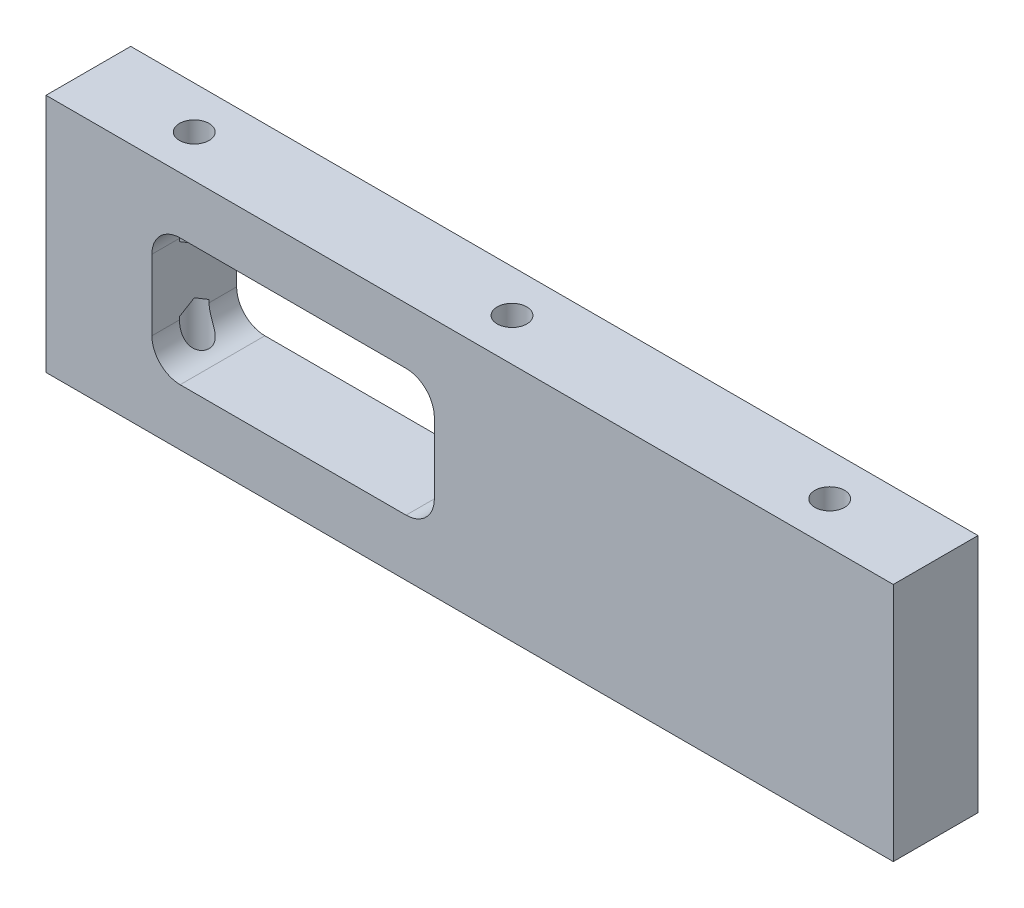
ISO-10303-21;
HEADER;
FILE_DESCRIPTION(('STEP AP214'),'2;1');
FILE_NAME('part.step','',(''),(''),'','','');
FILE_SCHEMA(('AUTOMOTIVE_DESIGN { 1 0 10303 214 1 1 1 1 }'));
ENDSEC;
DATA;
#1=APPLICATION_CONTEXT('core data for automotive mechanical design processes');
#2=APPLICATION_PROTOCOL_DEFINITION('international standard','automotive_design',2000,#1);
#3=PRODUCT_CONTEXT('',#1,'mechanical');
#4=PRODUCT('Part','Part','',(#3));
#5=PRODUCT_RELATED_PRODUCT_CATEGORY('part','',(#4));
#6=PRODUCT_DEFINITION_FORMATION('','',#4);
#7=PRODUCT_DEFINITION_CONTEXT('part definition',#1,'design');
#8=PRODUCT_DEFINITION('design','',#6,#7);
#9=PRODUCT_DEFINITION_SHAPE('','',#8);
#10=(LENGTH_UNIT() NAMED_UNIT(*) SI_UNIT(.MILLI.,.METRE.));
#11=(NAMED_UNIT(*) PLANE_ANGLE_UNIT() SI_UNIT($,.RADIAN.));
#12=(NAMED_UNIT(*) SI_UNIT($,.STERADIAN.) SOLID_ANGLE_UNIT());
#13=UNCERTAINTY_MEASURE_WITH_UNIT(LENGTH_MEASURE(1.E-05),#10,'distance_accuracy_value','');
#14=(GEOMETRIC_REPRESENTATION_CONTEXT(3) GLOBAL_UNCERTAINTY_ASSIGNED_CONTEXT((#13)) GLOBAL_UNIT_ASSIGNED_CONTEXT((#10,
#11,#12)) REPRESENTATION_CONTEXT('',''));
#15=CARTESIAN_POINT('',(0.,0.,0.));
#16=DIRECTION('',(0.,0.,1.));
#17=DIRECTION('',(1.,0.,0.));
#18=AXIS2_PLACEMENT_3D('',#15,#16,#17);
#19=CARTESIAN_POINT('',(0.,0.,12.));
#20=DIRECTION('',(1.,0.,0.));
#21=DIRECTION('',(0.,0.,-1.));
#22=AXIS2_PLACEMENT_3D('',#19,#20,#21);
#23=PLANE('',#22);
#24=DIRECTION('',(0.,-1.,0.));
#25=VECTOR('',#24,1.);
#26=CARTESIAN_POINT('',(0.,0.,0.));
#27=LINE('',#26,#25);
#28=CARTESIAN_POINT('',(0.,34.,0.));
#29=VERTEX_POINT('',#28);
#30=CARTESIAN_POINT('',(0.,0.,0.));
#31=VERTEX_POINT('',#30);
#32=EDGE_CURVE('E236',#29,#31,#27,.T.);
#33=ORIENTED_EDGE('',*,*,#32,.T.);
#34=DIRECTION('',(0.,0.,-1.));
#35=VECTOR('',#34,1.);
#36=CARTESIAN_POINT('',(0.,0.,12.));
#37=LINE('',#36,#35);
#38=CARTESIAN_POINT('',(0.,0.,12.));
#39=VERTEX_POINT('',#38);
#40=EDGE_CURVE('E273',#39,#31,#37,.T.);
#41=ORIENTED_EDGE('',*,*,#40,.F.);
#42=DIRECTION('',(0.,-1.,0.));
#43=VECTOR('',#42,1.);
#44=CARTESIAN_POINT('',(0.,0.,12.));
#45=LINE('',#44,#43);
#46=CARTESIAN_POINT('',(0.,34.,12.));
#47=VERTEX_POINT('',#46);
#48=EDGE_CURVE('E247',#47,#39,#45,.T.);
#49=ORIENTED_EDGE('',*,*,#48,.F.);
#50=DIRECTION('',(0.,0.,-1.));
#51=VECTOR('',#50,1.);
#52=CARTESIAN_POINT('',(0.,34.,12.));
#53=LINE('',#52,#51);
#54=EDGE_CURVE('E257',#47,#29,#53,.T.);
#55=ORIENTED_EDGE('',*,*,#54,.T.);
#56=EDGE_LOOP('',(#33,#41,#49,#55));
#57=FACE_BOUND('',#56,.T.);
#58=ADVANCED_FACE('F37',(#57),#23,.F.);
#59=CARTESIAN_POINT('',(0.,0.,12.));
#60=DIRECTION('',(0.,1.,0.));
#61=DIRECTION('',(0.,0.,1.));
#62=AXIS2_PLACEMENT_3D('',#59,#60,#61);
#63=PLANE('',#62);
#64=CARTESIAN_POINT('',(105.,0.,6.));
#65=DIRECTION('',(0.,-1.,0.));
#66=DIRECTION('',(0.,0.,-1.));
#67=AXIS2_PLACEMENT_3D('',#64,#65,#66);
#68=CIRCLE('',#67,2.09999999999999);
#69=CARTESIAN_POINT('',(105.,0.,3.90000000000001));
#70=VERTEX_POINT('',#69);
#71=EDGE_CURVE('E180',#70,#70,#68,.T.);
#72=ORIENTED_EDGE('',*,*,#71,.F.);
#73=EDGE_LOOP('',(#72));
#74=FACE_BOUND('',#73,.T.);
#75=CARTESIAN_POINT('',(60.,0.,6.));
#76=DIRECTION('',(0.,-1.,0.));
#77=DIRECTION('',(0.,0.,-1.));
#78=AXIS2_PLACEMENT_3D('',#75,#76,#77);
#79=CIRCLE('',#78,2.09999999999999);
#80=CARTESIAN_POINT('',(60.,0.,3.90000000000001));
#81=VERTEX_POINT('',#80);
#82=EDGE_CURVE('E179',#81,#81,#79,.T.);
#83=ORIENTED_EDGE('',*,*,#82,.F.);
#84=EDGE_LOOP('',(#83));
#85=FACE_BOUND('',#84,.T.);
#86=CARTESIAN_POINT('',(15.,0.,6.));
#87=DIRECTION('',(0.,-1.,0.));
#88=DIRECTION('',(0.,0.,-1.));
#89=AXIS2_PLACEMENT_3D('',#86,#87,#88);
#90=CIRCLE('',#89,2.09999999999999);
#91=CARTESIAN_POINT('',(15.,0.,3.90000000000001));
#92=VERTEX_POINT('',#91);
#93=EDGE_CURVE('E190',#92,#92,#90,.T.);
#94=ORIENTED_EDGE('',*,*,#93,.F.);
#95=EDGE_LOOP('',(#94));
#96=FACE_BOUND('',#95,.T.);
#97=DIRECTION('',(1.,0.,0.));
#98=VECTOR('',#97,1.);
#99=CARTESIAN_POINT('',(0.,0.,0.));
#100=LINE('',#99,#98);
#101=CARTESIAN_POINT('',(120.,0.,0.));
#102=VERTEX_POINT('',#101);
#103=EDGE_CURVE('E260',#31,#102,#100,.T.);
#104=ORIENTED_EDGE('',*,*,#103,.T.);
#105=DIRECTION('',(0.,0.,-1.));
#106=VECTOR('',#105,1.);
#107=CARTESIAN_POINT('',(120.,0.,12.));
#108=LINE('',#107,#106);
#109=CARTESIAN_POINT('',(120.,0.,12.));
#110=VERTEX_POINT('',#109);
#111=EDGE_CURVE('E270',#110,#102,#108,.T.);
#112=ORIENTED_EDGE('',*,*,#111,.F.);
#113=DIRECTION('',(1.,0.,0.));
#114=VECTOR('',#113,1.);
#115=CARTESIAN_POINT('',(0.,0.,12.));
#116=LINE('',#115,#114);
#117=EDGE_CURVE('E250',#39,#110,#116,.T.);
#118=ORIENTED_EDGE('',*,*,#117,.F.);
#119=ORIENTED_EDGE('',*,*,#40,.T.);
#120=EDGE_LOOP('',(#104,#112,#118,#119));
#121=FACE_BOUND('',#120,.T.);
#122=ADVANCED_FACE('F383',(#74,#85,#96,#121),#63,.F.);
#123=CARTESIAN_POINT('',(120.,0.,12.));
#124=DIRECTION('',(-1.,0.,0.));
#125=DIRECTION('',(0.,0.,1.));
#126=AXIS2_PLACEMENT_3D('',#123,#124,#125);
#127=PLANE('',#126);
#128=DIRECTION('',(0.,1.,0.));
#129=VECTOR('',#128,1.);
#130=CARTESIAN_POINT('',(120.,0.,0.));
#131=LINE('',#130,#129);
#132=CARTESIAN_POINT('',(120.,34.,0.));
#133=VERTEX_POINT('',#132);
#134=EDGE_CURVE('E262',#102,#133,#131,.T.);
#135=ORIENTED_EDGE('',*,*,#134,.T.);
#136=DIRECTION('',(0.,0.,-1.));
#137=VECTOR('',#136,1.);
#138=CARTESIAN_POINT('',(120.,34.,12.));
#139=LINE('',#138,#137);
#140=CARTESIAN_POINT('',(120.,34.,12.));
#141=VERTEX_POINT('',#140);
#142=EDGE_CURVE('E267',#141,#133,#139,.T.);
#143=ORIENTED_EDGE('',*,*,#142,.F.);
#144=DIRECTION('',(0.,1.,0.));
#145=VECTOR('',#144,1.);
#146=CARTESIAN_POINT('',(120.,0.,12.));
#147=LINE('',#146,#145);
#148=EDGE_CURVE('E253',#110,#141,#147,.T.);
#149=ORIENTED_EDGE('',*,*,#148,.F.);
#150=ORIENTED_EDGE('',*,*,#111,.T.);
#151=EDGE_LOOP('',(#135,#143,#149,#150));
#152=FACE_BOUND('',#151,.T.);
#153=ADVANCED_FACE('F379',(#152),#127,.F.);
#154=CARTESIAN_POINT('',(0.,34.,12.));
#155=DIRECTION('',(0.,-1.,0.));
#156=DIRECTION('',(0.,0.,-1.));
#157=AXIS2_PLACEMENT_3D('',#154,#155,#156);
#158=PLANE('',#157);
#159=CARTESIAN_POINT('',(15.,34.,6.));
#160=DIRECTION('',(0.,1.,0.));
#161=DIRECTION('',(0.,0.,1.));
#162=AXIS2_PLACEMENT_3D('',#159,#160,#161);
#163=CIRCLE('',#162,2.1);
#164=CARTESIAN_POINT('',(15.,34.,8.1));
#165=VERTEX_POINT('',#164);
#166=EDGE_CURVE('E200',#165,#165,#163,.T.);
#167=ORIENTED_EDGE('',*,*,#166,.F.);
#168=EDGE_LOOP('',(#167));
#169=FACE_BOUND('',#168,.T.);
#170=CARTESIAN_POINT('',(60.,34.,6.));
#171=DIRECTION('',(0.,1.,0.));
#172=DIRECTION('',(0.,0.,1.));
#173=AXIS2_PLACEMENT_3D('',#170,#171,#172);
#174=CIRCLE('',#173,2.1);
#175=CARTESIAN_POINT('',(60.,34.,8.1));
#176=VERTEX_POINT('',#175);
#177=EDGE_CURVE('E210',#176,#176,#174,.T.);
#178=ORIENTED_EDGE('',*,*,#177,.F.);
#179=EDGE_LOOP('',(#178));
#180=FACE_BOUND('',#179,.T.);
#181=CARTESIAN_POINT('',(105.,34.,6.));
#182=DIRECTION('',(0.,1.,0.));
#183=DIRECTION('',(0.,0.,1.));
#184=AXIS2_PLACEMENT_3D('',#181,#182,#183);
#185=CIRCLE('',#184,2.1);
#186=CARTESIAN_POINT('',(105.,34.,8.1));
#187=VERTEX_POINT('',#186);
#188=EDGE_CURVE('E216',#187,#187,#185,.T.);
#189=ORIENTED_EDGE('',*,*,#188,.F.);
#190=EDGE_LOOP('',(#189));
#191=FACE_BOUND('',#190,.T.);
#192=DIRECTION('',(-1.,0.,0.));
#193=VECTOR('',#192,1.);
#194=CARTESIAN_POINT('',(0.,34.,0.));
#195=LINE('',#194,#193);
#196=EDGE_CURVE('E251',#133,#29,#195,.T.);
#197=ORIENTED_EDGE('',*,*,#196,.T.);
#198=ORIENTED_EDGE('',*,*,#54,.F.);
#199=DIRECTION('',(-1.,0.,0.));
#200=VECTOR('',#199,1.);
#201=CARTESIAN_POINT('',(0.,34.,12.));
#202=LINE('',#201,#200);
#203=EDGE_CURVE('E255',#141,#47,#202,.T.);
#204=ORIENTED_EDGE('',*,*,#203,.F.);
#205=ORIENTED_EDGE('',*,*,#142,.T.);
#206=EDGE_LOOP('',(#197,#198,#204,#205));
#207=FACE_BOUND('',#206,.T.);
#208=ADVANCED_FACE('F372',(#169,#180,#191,#207),#158,.F.);
#209=CARTESIAN_POINT('',(0.,34.,12.));
#210=DIRECTION('',(0.,0.,-1.));
#211=DIRECTION('',(-1.,0.,0.));
#212=AXIS2_PLACEMENT_3D('',#209,#210,#211);
#213=PLANE('',#212);
#214=DIRECTION('',(-1.,0.,0.));
#215=VECTOR('',#214,1.);
#216=CARTESIAN_POINT('',(55.,26.,12.));
#217=LINE('',#216,#215);
#218=CARTESIAN_POINT('',(51.,26.,12.));
#219=VERTEX_POINT('',#218);
#220=CARTESIAN_POINT('',(19.,26.,12.));
#221=VERTEX_POINT('',#220);
#222=EDGE_CURVE('E239',#219,#221,#217,.T.);
#223=ORIENTED_EDGE('',*,*,#222,.F.);
#224=CARTESIAN_POINT('',(51.,22.,12.));
#225=DIRECTION('',(0.,0.,-1.));
#226=DIRECTION('',(-1.,0.,0.));
#227=AXIS2_PLACEMENT_3D('',#224,#225,#226);
#228=CIRCLE('',#227,4.);
#229=CARTESIAN_POINT('',(55.,22.,12.));
#230=VERTEX_POINT('',#229);
#231=EDGE_CURVE('E299',#219,#230,#228,.T.);
#232=ORIENTED_EDGE('',*,*,#231,.T.);
#233=DIRECTION('',(0.,1.,0.));
#234=VECTOR('',#233,1.);
#235=CARTESIAN_POINT('',(55.,26.,12.));
#236=LINE('',#235,#234);
#237=CARTESIAN_POINT('',(55.,12.,12.));
#238=VERTEX_POINT('',#237);
#239=EDGE_CURVE('E222',#238,#230,#236,.T.);
#240=ORIENTED_EDGE('',*,*,#239,.F.);
#241=CARTESIAN_POINT('',(51.,12.,12.));
#242=DIRECTION('',(0.,0.,-1.));
#243=DIRECTION('',(-1.,0.,0.));
#244=AXIS2_PLACEMENT_3D('',#241,#242,#243);
#245=CIRCLE('',#244,4.);
#246=CARTESIAN_POINT('',(51.,8.00000000000001,12.));
#247=VERTEX_POINT('',#246);
#248=EDGE_CURVE('E303',#238,#247,#245,.T.);
#249=ORIENTED_EDGE('',*,*,#248,.T.);
#250=DIRECTION('',(1.,0.,0.));
#251=VECTOR('',#250,1.);
#252=CARTESIAN_POINT('',(55.,8.00000000000001,12.));
#253=LINE('',#252,#251);
#254=CARTESIAN_POINT('',(19.,8.,12.));
#255=VERTEX_POINT('',#254);
#256=EDGE_CURVE('E227',#255,#247,#253,.T.);
#257=ORIENTED_EDGE('',*,*,#256,.F.);
#258=CARTESIAN_POINT('',(19.,12.,12.));
#259=DIRECTION('',(0.,0.,-1.));
#260=DIRECTION('',(-1.,0.,0.));
#261=AXIS2_PLACEMENT_3D('',#258,#259,#260);
#262=CIRCLE('',#261,4.);
#263=CARTESIAN_POINT('',(15.,12.,12.));
#264=VERTEX_POINT('',#263);
#265=EDGE_CURVE('E307',#255,#264,#262,.T.);
#266=ORIENTED_EDGE('',*,*,#265,.T.);
#267=DIRECTION('',(0.,-1.,0.));
#268=VECTOR('',#267,1.);
#269=CARTESIAN_POINT('',(15.,26.,12.));
#270=LINE('',#269,#268);
#271=CARTESIAN_POINT('',(15.,22.,12.));
#272=VERTEX_POINT('',#271);
#273=EDGE_CURVE('E242',#272,#264,#270,.T.);
#274=ORIENTED_EDGE('',*,*,#273,.F.);
#275=CARTESIAN_POINT('',(19.,22.,12.));
#276=DIRECTION('',(0.,0.,-1.));
#277=DIRECTION('',(-1.,0.,0.));
#278=AXIS2_PLACEMENT_3D('',#275,#276,#277);
#279=CIRCLE('',#278,4.);
#280=EDGE_CURVE('E311',#272,#221,#279,.T.);
#281=ORIENTED_EDGE('',*,*,#280,.T.);
#282=EDGE_LOOP('',(#223,#232,#240,#249,#257,#266,#274,#281));
#283=FACE_BOUND('',#282,.T.);
#284=ORIENTED_EDGE('',*,*,#48,.T.);
#285=ORIENTED_EDGE('',*,*,#117,.T.);
#286=ORIENTED_EDGE('',*,*,#148,.T.);
#287=ORIENTED_EDGE('',*,*,#203,.T.);
#288=EDGE_LOOP('',(#284,#285,#286,#287));
#289=FACE_BOUND('',#288,.T.);
#290=ADVANCED_FACE('F369',(#283,#289),#213,.F.);
#291=CARTESIAN_POINT('',(0.,34.,0.));
#292=DIRECTION('',(0.,0.,-1.));
#293=DIRECTION('',(-1.,0.,0.));
#294=AXIS2_PLACEMENT_3D('',#291,#292,#293);
#295=PLANE('',#294);
#296=DIRECTION('',(1.,0.,0.));
#297=VECTOR('',#296,1.);
#298=CARTESIAN_POINT('',(55.,8.00000000000001,0.));
#299=LINE('',#298,#297);
#300=CARTESIAN_POINT('',(19.,8.,0.));
#301=VERTEX_POINT('',#300);
#302=CARTESIAN_POINT('',(51.,8.00000000000001,0.));
#303=VERTEX_POINT('',#302);
#304=EDGE_CURVE('E233',#301,#303,#299,.T.);
#305=ORIENTED_EDGE('',*,*,#304,.T.);
#306=CARTESIAN_POINT('',(51.,12.,0.));
#307=DIRECTION('',(0.,0.,-1.));
#308=DIRECTION('',(-1.,0.,0.));
#309=AXIS2_PLACEMENT_3D('',#306,#307,#308);
#310=CIRCLE('',#309,4.);
#311=CARTESIAN_POINT('',(55.,12.,0.));
#312=VERTEX_POINT('',#311);
#313=EDGE_CURVE('E305',#303,#312,#310,.F.);
#314=ORIENTED_EDGE('',*,*,#313,.T.);
#315=DIRECTION('',(0.,1.,0.));
#316=VECTOR('',#315,1.);
#317=CARTESIAN_POINT('',(55.,26.,0.));
#318=LINE('',#317,#316);
#319=CARTESIAN_POINT('',(55.,22.,0.));
#320=VERTEX_POINT('',#319);
#321=EDGE_CURVE('E223',#312,#320,#318,.T.);
#322=ORIENTED_EDGE('',*,*,#321,.T.);
#323=CARTESIAN_POINT('',(51.,22.,0.));
#324=DIRECTION('',(0.,0.,-1.));
#325=DIRECTION('',(-1.,0.,0.));
#326=AXIS2_PLACEMENT_3D('',#323,#324,#325);
#327=CIRCLE('',#326,4.);
#328=CARTESIAN_POINT('',(51.,26.,0.));
#329=VERTEX_POINT('',#328);
#330=EDGE_CURVE('E301',#320,#329,#327,.F.);
#331=ORIENTED_EDGE('',*,*,#330,.T.);
#332=DIRECTION('',(-1.,0.,0.));
#333=VECTOR('',#332,1.);
#334=CARTESIAN_POINT('',(55.,26.,0.));
#335=LINE('',#334,#333);
#336=CARTESIAN_POINT('',(19.,26.,0.));
#337=VERTEX_POINT('',#336);
#338=EDGE_CURVE('E226',#329,#337,#335,.T.);
#339=ORIENTED_EDGE('',*,*,#338,.T.);
#340=CARTESIAN_POINT('',(19.,22.,0.));
#341=DIRECTION('',(0.,0.,-1.));
#342=DIRECTION('',(-1.,0.,0.));
#343=AXIS2_PLACEMENT_3D('',#340,#341,#342);
#344=CIRCLE('',#343,4.);
#345=CARTESIAN_POINT('',(15.,22.,0.));
#346=VERTEX_POINT('',#345);
#347=EDGE_CURVE('E313',#337,#346,#344,.F.);
#348=ORIENTED_EDGE('',*,*,#347,.T.);
#349=DIRECTION('',(0.,-1.,0.));
#350=VECTOR('',#349,1.);
#351=CARTESIAN_POINT('',(15.,26.,0.));
#352=LINE('',#351,#350);
#353=CARTESIAN_POINT('',(15.,12.,0.));
#354=VERTEX_POINT('',#353);
#355=EDGE_CURVE('E230',#346,#354,#352,.T.);
#356=ORIENTED_EDGE('',*,*,#355,.T.);
#357=CARTESIAN_POINT('',(19.,12.,0.));
#358=DIRECTION('',(0.,0.,-1.));
#359=DIRECTION('',(-1.,0.,0.));
#360=AXIS2_PLACEMENT_3D('',#357,#358,#359);
#361=CIRCLE('',#360,4.);
#362=EDGE_CURVE('E309',#354,#301,#361,.F.);
#363=ORIENTED_EDGE('',*,*,#362,.T.);
#364=EDGE_LOOP('',(#305,#314,#322,#331,#339,#348,#356,#363));
#365=FACE_BOUND('',#364,.T.);
#366=ORIENTED_EDGE('',*,*,#32,.F.);
#367=ORIENTED_EDGE('',*,*,#196,.F.);
#368=ORIENTED_EDGE('',*,*,#134,.F.);
#369=ORIENTED_EDGE('',*,*,#103,.F.);
#370=EDGE_LOOP('',(#366,#367,#368,#369));
#371=FACE_BOUND('',#370,.T.);
#372=ADVANCED_FACE('F367',(#365,#371),#295,.T.);
#373=CARTESIAN_POINT('',(55.,26.,0.));
#374=DIRECTION('',(1.,0.,0.));
#375=DIRECTION('',(0.,0.,-1.));
#376=AXIS2_PLACEMENT_3D('',#373,#374,#375);
#377=PLANE('',#376);
#378=ORIENTED_EDGE('',*,*,#239,.T.);
#379=DIRECTION('',(0.,0.,1.));
#380=VECTOR('',#379,1.);
#381=CARTESIAN_POINT('',(55.,22.,0.));
#382=LINE('',#381,#380);
#383=EDGE_CURVE('E284',#230,#320,#382,.F.);
#384=ORIENTED_EDGE('',*,*,#383,.T.);
#385=ORIENTED_EDGE('',*,*,#321,.F.);
#386=DIRECTION('',(0.,0.,1.));
#387=VECTOR('',#386,1.);
#388=CARTESIAN_POINT('',(55.,12.,12.));
#389=LINE('',#388,#387);
#390=EDGE_CURVE('E281',#312,#238,#389,.T.);
#391=ORIENTED_EDGE('',*,*,#390,.T.);
#392=EDGE_LOOP('',(#378,#384,#385,#391));
#393=FACE_BOUND('',#392,.T.);
#394=ADVANCED_FACE('F355',(#393),#377,.F.);
#395=CARTESIAN_POINT('',(55.,8.00000000000001,0.));
#396=DIRECTION('',(0.,-1.,0.));
#397=DIRECTION('',(1.,0.,0.));
#398=AXIS2_PLACEMENT_3D('',#395,#396,#397);
#399=PLANE('',#398);
#400=ORIENTED_EDGE('',*,*,#256,.T.);
#401=DIRECTION('',(0.,0.,1.));
#402=VECTOR('',#401,1.);
#403=CARTESIAN_POINT('',(51.,8.00000000000001,0.));
#404=LINE('',#403,#402);
#405=EDGE_CURVE('E289',#247,#303,#404,.F.);
#406=ORIENTED_EDGE('',*,*,#405,.T.);
#407=ORIENTED_EDGE('',*,*,#304,.F.);
#408=DIRECTION('',(0.,0.,1.));
#409=VECTOR('',#408,1.);
#410=CARTESIAN_POINT('',(19.,8.,12.));
#411=LINE('',#410,#409);
#412=EDGE_CURVE('E286',#301,#255,#411,.T.);
#413=ORIENTED_EDGE('',*,*,#412,.T.);
#414=EDGE_LOOP('',(#400,#406,#407,#413));
#415=FACE_BOUND('',#414,.T.);
#416=ADVANCED_FACE('F351',(#415),#399,.F.);
#417=CARTESIAN_POINT('',(15.,26.,0.));
#418=DIRECTION('',(-1.,0.,0.));
#419=DIRECTION('',(0.,0.,1.));
#420=AXIS2_PLACEMENT_3D('',#417,#418,#419);
#421=PLANE('',#420);
#422=DIRECTION('',(0.,-0.515038074910054,-0.857167300702112));
#423=VECTOR('',#422,1.);
#424=CARTESIAN_POINT('',(15.,13.6618072999579,6.));
#425=LINE('',#424,#423);
#426=CARTESIAN_POINT('',(15.,13.6618072999579,6.));
#427=VERTEX_POINT('',#426);
#428=CARTESIAN_POINT('',(15.,12.4,3.90000000000001));
#429=VERTEX_POINT('',#428);
#430=EDGE_CURVE('E11',#427,#429,#425,.T.);
#431=ORIENTED_EDGE('',*,*,#430,.T.);
#432=DIRECTION('',(0.,-1.,0.));
#433=VECTOR('',#432,1.);
#434=CARTESIAN_POINT('',(15.,0.,3.90000000000001));
#435=LINE('',#434,#433);
#436=CARTESIAN_POINT('',(15.,12.,3.90000000000001));
#437=VERTEX_POINT('',#436);
#438=EDGE_CURVE('E197',#429,#437,#435,.T.);
#439=ORIENTED_EDGE('',*,*,#438,.T.);
#440=DIRECTION('',(0.,0.,1.));
#441=VECTOR('',#440,1.);
#442=CARTESIAN_POINT('',(15.,12.,0.));
#443=LINE('',#442,#441);
#444=EDGE_CURVE('E295',#437,#354,#443,.F.);
#445=ORIENTED_EDGE('',*,*,#444,.T.);
#446=ORIENTED_EDGE('',*,*,#355,.F.);
#447=DIRECTION('',(0.,0.,1.));
#448=VECTOR('',#447,1.);
#449=CARTESIAN_POINT('',(15.,22.,12.));
#450=LINE('',#449,#448);
#451=CARTESIAN_POINT('',(15.,22.,3.9));
#452=VERTEX_POINT('',#451);
#453=EDGE_CURVE('E292',#346,#452,#450,.T.);
#454=ORIENTED_EDGE('',*,*,#453,.T.);
#455=DIRECTION('',(0.,1.,0.));
#456=VECTOR('',#455,1.);
#457=CARTESIAN_POINT('',(15.,34.,3.9));
#458=LINE('',#457,#456);
#459=CARTESIAN_POINT('',(15.,21.6,3.90000000000001));
#460=VERTEX_POINT('',#459);
#461=EDGE_CURVE('E61',#452,#460,#458,.F.);
#462=ORIENTED_EDGE('',*,*,#461,.T.);
#463=DIRECTION('',(0.,-0.515038074910054,0.857167300702112));
#464=VECTOR('',#463,1.);
#465=CARTESIAN_POINT('',(15.,20.3381927000421,6.));
#466=LINE('',#465,#464);
#467=CARTESIAN_POINT('',(15.,20.3381927000421,6.));
#468=VERTEX_POINT('',#467);
#469=EDGE_CURVE('E321',#460,#468,#466,.T.);
#470=ORIENTED_EDGE('',*,*,#469,.T.);
#471=DIRECTION('',(0.,0.515038074910054,0.857167300702112));
#472=VECTOR('',#471,1.);
#473=CARTESIAN_POINT('',(15.,20.3381927000421,6.));
#474=LINE('',#473,#472);
#475=CARTESIAN_POINT('',(15.,21.6,8.09999999999999));
#476=VERTEX_POINT('',#475);
#477=EDGE_CURVE('E406',#468,#476,#474,.T.);
#478=ORIENTED_EDGE('',*,*,#477,.T.);
#479=DIRECTION('',(0.,1.,0.));
#480=VECTOR('',#479,1.);
#481=CARTESIAN_POINT('',(15.,34.,8.1));
#482=LINE('',#481,#480);
#483=CARTESIAN_POINT('',(15.,22.,8.1));
#484=VERTEX_POINT('',#483);
#485=EDGE_CURVE('E207',#476,#484,#482,.T.);
#486=ORIENTED_EDGE('',*,*,#485,.T.);
#487=EDGE_CURVE('E291',#484,#272,#450,.T.);
#488=ORIENTED_EDGE('',*,*,#487,.T.);
#489=ORIENTED_EDGE('',*,*,#273,.T.);
#490=CARTESIAN_POINT('',(15.,12.,8.09999999999999));
#491=VERTEX_POINT('',#490);
#492=EDGE_CURVE('E296',#264,#491,#443,.F.);
#493=ORIENTED_EDGE('',*,*,#492,.T.);
#494=DIRECTION('',(0.,-1.,0.));
#495=VECTOR('',#494,1.);
#496=CARTESIAN_POINT('',(15.,0.,8.09999999999999));
#497=LINE('',#496,#495);
#498=CARTESIAN_POINT('',(15.,12.4,8.09999999999999));
#499=VERTEX_POINT('',#498);
#500=EDGE_CURVE('E53',#491,#499,#497,.F.);
#501=ORIENTED_EDGE('',*,*,#500,.T.);
#502=DIRECTION('',(0.,0.515038074910054,-0.857167300702112));
#503=VECTOR('',#502,1.);
#504=CARTESIAN_POINT('',(15.,13.6618072999579,6.));
#505=LINE('',#504,#503);
#506=EDGE_CURVE('E46',#499,#427,#505,.T.);
#507=ORIENTED_EDGE('',*,*,#506,.T.);
#508=EDGE_LOOP('',(#431,#439,#445,#446,#454,#462,#470,#478,#486,#488,#489,#493,#501,#507));
#509=FACE_BOUND('',#508,.T.);
#510=ADVANCED_FACE('F354',(#509),#421,.F.);
#511=CARTESIAN_POINT('',(55.,26.,0.));
#512=DIRECTION('',(0.,1.,0.));
#513=DIRECTION('',(-1.,0.,0.));
#514=AXIS2_PLACEMENT_3D('',#511,#512,#513);
#515=PLANE('',#514);
#516=ORIENTED_EDGE('',*,*,#338,.F.);
#517=DIRECTION('',(0.,0.,1.));
#518=VECTOR('',#517,1.);
#519=CARTESIAN_POINT('',(51.,26.,12.));
#520=LINE('',#519,#518);
#521=EDGE_CURVE('E278',#329,#219,#520,.T.);
#522=ORIENTED_EDGE('',*,*,#521,.T.);
#523=ORIENTED_EDGE('',*,*,#222,.T.);
#524=DIRECTION('',(0.,0.,1.));
#525=VECTOR('',#524,1.);
#526=CARTESIAN_POINT('',(19.,26.,0.));
#527=LINE('',#526,#525);
#528=EDGE_CURVE('E276',#221,#337,#527,.F.);
#529=ORIENTED_EDGE('',*,*,#528,.T.);
#530=EDGE_LOOP('',(#516,#522,#523,#529));
#531=FACE_BOUND('',#530,.T.);
#532=ADVANCED_FACE('F359',(#531),#515,.F.);
#533=CARTESIAN_POINT('',(51.,22.,0.));
#534=DIRECTION('',(0.,0.,-1.));
#535=DIRECTION('',(-1.,0.,0.));
#536=AXIS2_PLACEMENT_3D('',#533,#534,#535);
#537=CYLINDRICAL_SURFACE('',#536,4.);
#538=ORIENTED_EDGE('',*,*,#330,.F.);
#539=ORIENTED_EDGE('',*,*,#383,.F.);
#540=ORIENTED_EDGE('',*,*,#231,.F.);
#541=ORIENTED_EDGE('',*,*,#521,.F.);
#542=EDGE_LOOP('',(#538,#539,#540,#541));
#543=FACE_BOUND('',#542,.T.);
#544=ADVANCED_FACE('F363',(#543),#537,.F.);
#545=CARTESIAN_POINT('',(51.,12.,0.));
#546=DIRECTION('',(0.,0.,-1.));
#547=DIRECTION('',(-1.,0.,0.));
#548=AXIS2_PLACEMENT_3D('',#545,#546,#547);
#549=CYLINDRICAL_SURFACE('',#548,4.);
#550=ORIENTED_EDGE('',*,*,#313,.F.);
#551=ORIENTED_EDGE('',*,*,#405,.F.);
#552=ORIENTED_EDGE('',*,*,#248,.F.);
#553=ORIENTED_EDGE('',*,*,#390,.F.);
#554=EDGE_LOOP('',(#550,#551,#552,#553));
#555=FACE_BOUND('',#554,.T.);
#556=ADVANCED_FACE('F393',(#555),#549,.F.);
#557=CARTESIAN_POINT('',(19.,12.,0.));
#558=DIRECTION('',(0.,0.,-1.));
#559=DIRECTION('',(-1.,0.,0.));
#560=AXIS2_PLACEMENT_3D('',#557,#558,#559);
#561=CYLINDRICAL_SURFACE('',#560,4.);
#562=ORIENTED_EDGE('',*,*,#444,.F.);
#563=CARTESIAN_POINT('',(15.,12.,3.90000000000001));
#564=CARTESIAN_POINT('',(15.0000000680288,11.9440763635864,3.90000311499299));
#565=CARTESIAN_POINT('',(15.0011729833652,11.8881595025094,3.89999959719272));
#566=CARTESIAN_POINT('',(15.0058615680029,11.7764253264862,3.90000629387711));
#567=CARTESIAN_POINT('',(15.0093771856936,11.7206080093742,3.90001650805924));
#568=CARTESIAN_POINT('',(15.023434772687,11.5534186088144,3.90010824909218));
#569=CARTESIAN_POINT('',(15.0374874746901,11.4423212098241,3.90025088543619));
#570=CARTESIAN_POINT('',(15.0749530965372,11.2211135354793,3.90125449120476));
#571=CARTESIAN_POINT('',(15.098416380343,11.1110118845458,3.9021193532607));
#572=CARTESIAN_POINT('',(15.1545270887972,10.8932138017695,3.90550427942431));
#573=CARTESIAN_POINT('',(15.1871722087631,10.7855167736682,3.90802392838455));
#574=CARTESIAN_POINT('',(15.2549505786572,10.5917233843661,3.91530623880827));
#575=CARTESIAN_POINT('',(15.2886750999717,10.5051147889775,3.91960516692327));
#576=CARTESIAN_POINT('',(15.3619897994064,10.3346204151946,3.93110149691153));
#577=CARTESIAN_POINT('',(15.4015789151266,10.2507341469858,3.93829837421204));
#578=CARTESIAN_POINT('',(15.4861848915439,10.0864668644592,3.95659804095247));
#579=CARTESIAN_POINT('',(15.5311861892209,10.0060766635806,3.96768979902961));
#580=CARTESIAN_POINT('',(15.62618536748,9.84923565440737,3.99492353589287));
#581=CARTESIAN_POINT('',(15.6761814891031,9.77278347358799,4.01106374107305));
#582=CARTESIAN_POINT('',(15.8041027616462,9.59095207016056,4.05836439857983));
#583=CARTESIAN_POINT('',(15.884440743648,9.48810958894951,4.09301641097808));
#584=CARTESIAN_POINT('',(16.0507074517113,9.29484405317564,4.1793567877877));
#585=CARTESIAN_POINT('',(16.1366287842841,9.20440504863956,4.23102297664838));
#586=CARTESIAN_POINT('',(16.2949970516287,9.05159316990441,4.34443590066519));
#587=CARTESIAN_POINT('',(16.3674138233497,8.9870441903187,4.40327286152855));
#588=CARTESIAN_POINT('',(16.5082625181002,8.86956040948576,4.5356022489819));
#589=CARTESIAN_POINT('',(16.5766954359461,8.81662269954708,4.60909099638708));
#590=CARTESIAN_POINT('',(16.7053831336119,8.72263293970352,4.77022963078031));
#591=CARTESIAN_POINT('',(16.7656042119681,8.68162912988079,4.85793482156697));
#592=CARTESIAN_POINT('',(16.8734473116293,8.61149914140876,5.04509021225062));
#593=CARTESIAN_POINT('',(16.9210695141531,8.58237279191401,5.14454024318323));
#594=CARTESIAN_POINT('',(16.9976578458953,8.53698595743736,5.34428775968189));
#595=CARTESIAN_POINT('',(17.0277425063959,8.51993380742625,5.44397960479721));
#596=CARTESIAN_POINT('',(17.0728815841494,8.49473387994412,5.64779021010043));
#597=CARTESIAN_POINT('',(17.0879375664746,8.4865851752684,5.75190850814409));
#598=CARTESIAN_POINT('',(17.102184009268,8.47886960819424,5.96019765412801));
#599=CARTESIAN_POINT('',(17.1015738895284,8.47919487811789,6.064350979365));
#600=CARTESIAN_POINT('',(17.085011373584,8.48817630657085,6.2710649339727));
#601=CARTESIAN_POINT('',(17.0690596369798,8.4968321069356,6.37362563162455));
#602=CARTESIAN_POINT('',(17.0225645180449,8.52286716573842,6.57432572674214));
#603=CARTESIAN_POINT('',(16.9920090954357,8.54025362292799,6.67246140272376));
#604=CARTESIAN_POINT('',(16.9178753012726,8.58435879848268,6.86142386202536));
#605=CARTESIAN_POINT('',(16.8742991546565,8.61107592258619,6.95225189068878));
#606=CARTESIAN_POINT('',(16.77651141117,8.67442102297342,7.12418308600562));
#607=CARTESIAN_POINT('',(16.7223005883821,8.71104827798678,7.20528695977415));
#608=CARTESIAN_POINT('',(16.6063248007211,8.79447258632793,7.35601212844899));
#609=CARTESIAN_POINT('',(16.5445596380409,8.84126990597925,7.42563312256909));
#610=CARTESIAN_POINT('',(16.4148982612801,8.94640835911424,7.55457114407058));
#611=CARTESIAN_POINT('',(16.3468702219693,9.00506662514297,7.61349462264399));
#612=CARTESIAN_POINT('',(16.2100276494442,9.13211500681096,7.71851277529385));
#613=CARTESIAN_POINT('',(16.1412128197534,9.20050891015052,7.7646024355781));
#614=CARTESIAN_POINT('',(16.0259256628417,9.32422221056517,7.83318141114259));
#615=CARTESIAN_POINT('',(15.9788707002789,9.37741707783782,7.85861794316676));
#616=CARTESIAN_POINT('',(15.8866637074816,9.48757251378213,7.9043305516838));
#617=CARTESIAN_POINT('',(15.8415123226635,9.54453434310992,7.92460488946808));
#618=CARTESIAN_POINT('',(15.7536957916347,9.66186148756818,7.96066358089517));
#619=CARTESIAN_POINT('',(15.7110355012154,9.72223302643146,7.9764393837547));
#620=CARTESIAN_POINT('',(15.6287599083678,9.84587405793329,8.00413196486523));
#621=CARTESIAN_POINT('',(15.5891454206688,9.9091443187852,8.0160477133007));
#622=CARTESIAN_POINT('',(15.5002993350346,10.0603615059314,8.04021834086974));
#623=CARTESIAN_POINT('',(15.4524365638941,10.1493214930823,8.05118459198458));
#624=CARTESIAN_POINT('',(15.3634398038552,10.3309672057063,8.06880882481917));
#625=CARTESIAN_POINT('',(15.3223083581513,10.4236543229447,8.07546518099192));
#626=CARTESIAN_POINT('',(15.2471338201039,10.6120902116201,8.08575286257704));
#627=CARTESIAN_POINT('',(15.213095893181,10.7078411559806,8.08938198932899));
#628=CARTESIAN_POINT('',(15.152402465012,10.9016809248568,8.09468432821613));
#629=CARTESIAN_POINT('',(15.1257451552353,10.9997691702359,8.09635801983117));
#630=CARTESIAN_POINT('',(15.0857595893502,11.1726643916804,8.09831732035554));
#631=CARTESIAN_POINT('',(15.0707653567849,11.247088757213,8.09884686441373));
#632=CARTESIAN_POINT('',(15.0450356217999,11.3966642921839,8.09955641939381));
#633=CARTESIAN_POINT('',(15.0342995383855,11.4718153610344,8.09973647801361));
#634=CARTESIAN_POINT('',(15.0171497758725,11.6223468661923,8.09994838410063));
#635=CARTESIAN_POINT('',(15.0107213836477,11.6977256292415,8.09998073828381));
#636=CARTESIAN_POINT('',(15.0021450275705,11.8487360191913,8.09999955358907));
#637=CARTESIAN_POINT('',(14.9999976166185,11.9243676774907,8.0999860087838));
#638=CARTESIAN_POINT('',(15.,12.,8.09999999999999));
#639=B_SPLINE_CURVE_WITH_KNOTS('',3,(#563,#564,#565,#566,#567,#568,#569,#570,#571,#572,#573,
#574,#575,#576,#577,#578,#579,#580,#581,#582,#583,#584,#585,#586,#587,#588,#589,#590,#591,#592,
#593,#594,#595,#596,#597,#598,#599,#600,#601,#602,#603,#604,#605,#606,#607,#608,#609,#610,#611,
#612,#613,#614,#615,#616,#617,#618,#619,#620,#621,#622,#623,#624,#625,#626,#627,#628,#629,#630,
#631,#632,#633,#634,#635,#636,#637,#638),.UNSPECIFIED.,.F.,.F.,(4,2,2,2,2,2,2,2,2,2,2,2,2,2,2,2,
2,2,2,2,2,2,2,2,2,2,2,2,2,2,2,2,2,2,2,2,2,4),(0.,0.167745080580675,0.335486465801843,
0.671005521678533,1.00834470866525,1.34559929743261,1.6244783532099,1.90330695032648,
2.1813521152219,2.45929970759606,2.86282618194815,3.26582878506806,3.60474189708993,
3.94357001216991,4.28374932259477,4.62392373970587,4.93896154208023,5.253966533293,
5.56496371720695,5.8759475306407,6.18718818388113,6.49837568374403,6.80954054112371,
7.12071354796084,7.44168622571074,7.76278412259855,7.98881147348878,8.21491485355429,
8.44144518732988,8.66803590696311,8.97243608955031,9.27695101484444,9.5816869155913,
9.88634807828728,10.1139966017,10.3416140533747,10.5684500492179,10.7953153396496),.UNSPECIFIED.);
#640=EDGE_CURVE('E402',#437,#491,#639,.T.);
#641=ORIENTED_EDGE('',*,*,#640,.T.);
#642=ORIENTED_EDGE('',*,*,#492,.F.);
#643=ORIENTED_EDGE('',*,*,#265,.F.);
#644=ORIENTED_EDGE('',*,*,#412,.F.);
#645=ORIENTED_EDGE('',*,*,#362,.F.);
#646=EDGE_LOOP('',(#562,#641,#642,#643,#644,#645));
#647=FACE_BOUND('',#646,.T.);
#648=ADVANCED_FACE('F396',(#647),#561,.F.);
#649=CARTESIAN_POINT('',(19.,22.,0.));
#650=DIRECTION('',(0.,0.,-1.));
#651=DIRECTION('',(-1.,0.,0.));
#652=AXIS2_PLACEMENT_3D('',#649,#650,#651);
#653=CYLINDRICAL_SURFACE('',#652,4.);
#654=ORIENTED_EDGE('',*,*,#487,.F.);
#655=CARTESIAN_POINT('',(15.,22.,8.1));
#656=CARTESIAN_POINT('',(15.0000000680288,22.0559236364136,8.09999688500701));
#657=CARTESIAN_POINT('',(15.0011729833652,22.1118404974906,8.10000040280728));
#658=CARTESIAN_POINT('',(15.0058615680029,22.2235746735138,8.0999937061229));
#659=CARTESIAN_POINT('',(15.0093771856936,22.2793919906258,8.09998349194076));
#660=CARTESIAN_POINT('',(15.023434772687,22.4465813911856,8.09989175090783));
#661=CARTESIAN_POINT('',(15.0374874746901,22.5576787901759,8.09974911456381));
#662=CARTESIAN_POINT('',(15.0749530965372,22.7788864645207,8.09874550879525));
#663=CARTESIAN_POINT('',(15.098416380343,22.8889881154542,8.09788064673931));
#664=CARTESIAN_POINT('',(15.1545270887973,23.1067861982305,8.0944957205757));
#665=CARTESIAN_POINT('',(15.1871722087631,23.2144832263318,8.09197607161546));
#666=CARTESIAN_POINT('',(15.2549505786572,23.4082766156339,8.08469376119174));
#667=CARTESIAN_POINT('',(15.2886750999717,23.4948852110225,8.08039483307674));
#668=CARTESIAN_POINT('',(15.3619897994064,23.6653795848055,8.06889850308848));
#669=CARTESIAN_POINT('',(15.4015789151266,23.7492658530142,8.06170162578797));
#670=CARTESIAN_POINT('',(15.4861848915439,23.9135331355408,8.04340195904753));
#671=CARTESIAN_POINT('',(15.5311861892209,23.9939233364194,8.03231020097039));
#672=CARTESIAN_POINT('',(15.62618536748,24.1507643455926,8.00507646410713));
#673=CARTESIAN_POINT('',(15.6761814891031,24.227216526412,7.98893625892695));
#674=CARTESIAN_POINT('',(15.8041027616462,24.4090479298394,7.94163560142018));
#675=CARTESIAN_POINT('',(15.884440743648,24.5118904110505,7.90698358902193));
#676=CARTESIAN_POINT('',(16.0507074517113,24.7051559468244,7.82064321221231));
#677=CARTESIAN_POINT('',(16.1366287842841,24.7955949513604,7.76897702335163));
#678=CARTESIAN_POINT('',(16.2949970516287,24.9484068300956,7.65556409933482));
#679=CARTESIAN_POINT('',(16.3674138233497,25.0129558096813,7.59672713847146));
#680=CARTESIAN_POINT('',(16.5082625181002,25.1304395905142,7.46439775101811));
#681=CARTESIAN_POINT('',(16.5766954359461,25.1833773004529,7.39090900361293));
#682=CARTESIAN_POINT('',(16.7053831336119,25.2773670602965,7.2297703692197));
#683=CARTESIAN_POINT('',(16.7656042119681,25.3183708701192,7.14206517843304));
#684=CARTESIAN_POINT('',(16.8734473116293,25.3885008585912,6.95490978774938));
#685=CARTESIAN_POINT('',(16.9210695141531,25.417627208086,6.85545975681678));
#686=CARTESIAN_POINT('',(16.9976578458953,25.4630140425626,6.65571224031812));
#687=CARTESIAN_POINT('',(17.0277425063959,25.4800661925738,6.55602039520279));
#688=CARTESIAN_POINT('',(17.0728815841494,25.5052661200559,6.35220978989958));
#689=CARTESIAN_POINT('',(17.0879375664746,25.5134148247316,6.24809149185591));
#690=CARTESIAN_POINT('',(17.102184009268,25.5211303918058,6.03980234587199));
#691=CARTESIAN_POINT('',(17.1015738895284,25.5208051218821,5.935649020635));
#692=CARTESIAN_POINT('',(17.085011373584,25.5118236934292,5.7289350660273));
#693=CARTESIAN_POINT('',(17.0690596369798,25.5031678930644,5.62637436837545));
#694=CARTESIAN_POINT('',(17.0225645180449,25.4771328342616,5.42567427325786));
#695=CARTESIAN_POINT('',(16.9920090954357,25.459746377072,5.32753859727623));
#696=CARTESIAN_POINT('',(16.9178753012726,25.4156412015173,5.13857613797463));
#697=CARTESIAN_POINT('',(16.8742991546565,25.3889240774138,5.04774810931121));
#698=CARTESIAN_POINT('',(16.77651141117,25.3255789770266,4.87581691399438));
#699=CARTESIAN_POINT('',(16.7223005883821,25.2889517220132,4.79471304022584));
#700=CARTESIAN_POINT('',(16.6063248007211,25.2055274136721,4.643987871551));
#701=CARTESIAN_POINT('',(16.5445596380409,25.1587300940208,4.5743668774309));
#702=CARTESIAN_POINT('',(16.4148982612801,25.0535916408858,4.44542885592941));
#703=CARTESIAN_POINT('',(16.3468702219693,24.994933374857,4.386505377356));
#704=CARTESIAN_POINT('',(16.2100276494442,24.867884993189,4.28148722470614));
#705=CARTESIAN_POINT('',(16.1412128197534,24.7994910898495,4.23539756442189));
#706=CARTESIAN_POINT('',(16.0259256628417,24.6757777894348,4.16681858885741));
#707=CARTESIAN_POINT('',(15.9788707002789,24.6225829221622,4.14138205683323));
#708=CARTESIAN_POINT('',(15.8866637074816,24.5124274862179,4.09566944831619));
#709=CARTESIAN_POINT('',(15.8415123226635,24.4554656568901,4.07539511053191));
#710=CARTESIAN_POINT('',(15.7536957916347,24.3381385124318,4.03933641910482));
#711=CARTESIAN_POINT('',(15.7110355012154,24.2777669735685,4.02356061624529));
#712=CARTESIAN_POINT('',(15.6287599083678,24.1541259420667,3.99586803513476));
#713=CARTESIAN_POINT('',(15.5891454206688,24.0908556812148,3.98395228669929));
#714=CARTESIAN_POINT('',(15.5002993350346,23.9396384940686,3.95978165913026));
#715=CARTESIAN_POINT('',(15.4524365638941,23.8506785069177,3.94881540801541));
#716=CARTESIAN_POINT('',(15.3634398038552,23.6690327942937,3.93119117518082));
#717=CARTESIAN_POINT('',(15.3223083581513,23.5763456770553,3.92453481900807));
#718=CARTESIAN_POINT('',(15.2471338201039,23.3879097883799,3.91424713742295));
#719=CARTESIAN_POINT('',(15.213095893181,23.2921588440194,3.910618010671));
#720=CARTESIAN_POINT('',(15.152402465012,23.0983190751432,3.90531567178386));
#721=CARTESIAN_POINT('',(15.1257451552353,23.0002308297641,3.90364198016882));
#722=CARTESIAN_POINT('',(15.0857595893502,22.8273356083196,3.90168267964445));
#723=CARTESIAN_POINT('',(15.0707653567849,22.752911242787,3.90115313558626));
#724=CARTESIAN_POINT('',(15.0450356217999,22.6033357078161,3.90044358060618));
#725=CARTESIAN_POINT('',(15.0342995383855,22.5281846389656,3.90026352198638));
#726=CARTESIAN_POINT('',(15.0171497758725,22.3776531338077,3.90005161589936));
#727=CARTESIAN_POINT('',(15.0107213836477,22.3022743707585,3.90001926171618));
#728=CARTESIAN_POINT('',(15.0021450275705,22.1512639808087,3.90000044641092));
#729=CARTESIAN_POINT('',(14.9999976166185,22.0756323225093,3.90001399121619));
#730=CARTESIAN_POINT('',(15.,22.,3.9));
#731=B_SPLINE_CURVE_WITH_KNOTS('',3,(#655,#656,#657,#658,#659,#660,#661,#662,#663,#664,#665,
#666,#667,#668,#669,#670,#671,#672,#673,#674,#675,#676,#677,#678,#679,#680,#681,#682,#683,#684,
#685,#686,#687,#688,#689,#690,#691,#692,#693,#694,#695,#696,#697,#698,#699,#700,#701,#702,#703,
#704,#705,#706,#707,#708,#709,#710,#711,#712,#713,#714,#715,#716,#717,#718,#719,#720,#721,#722,
#723,#724,#725,#726,#727,#728,#729,#730),.UNSPECIFIED.,.F.,.F.,(4,2,2,2,2,2,2,2,2,2,2,2,2,2,2,2,
2,2,2,2,2,2,2,2,2,2,2,2,2,2,2,2,2,2,2,2,2,4),(0.,0.167745080580675,0.335486465801843,
0.671005521678535,1.00834470866525,1.34559929743261,1.62447835320991,1.90330695032648,
2.1813521152219,2.45929970759606,2.86282618194815,3.26582878506806,3.60474189708994,
3.94357001216992,4.28374932259477,4.62392373970588,4.93896154208024,5.25396653329301,
5.56496371720696,5.87594753064072,6.18718818388115,6.49837568374405,6.80954054112373,
7.12071354796087,7.44168622571076,7.76278412259858,7.98881147348881,8.21491485355432,
8.44144518732991,8.66803590696314,8.97243608955034,9.27695101484447,9.58168691559133,
9.88634807828731,10.1139966017,10.3416140533747,10.568450049218,10.7953153396496),.UNSPECIFIED.);
#732=EDGE_CURVE('E315',#484,#452,#731,.T.);
#733=ORIENTED_EDGE('',*,*,#732,.T.);
#734=ORIENTED_EDGE('',*,*,#453,.F.);
#735=ORIENTED_EDGE('',*,*,#347,.F.);
#736=ORIENTED_EDGE('',*,*,#528,.F.);
#737=ORIENTED_EDGE('',*,*,#280,.F.);
#738=EDGE_LOOP('',(#654,#733,#734,#735,#736,#737));
#739=FACE_BOUND('',#738,.T.);
#740=ADVANCED_FACE('F39',(#739),#653,.F.);
#741=CARTESIAN_POINT('',(105.,21.6,6.));
#742=DIRECTION('',(0.,1.,0.));
#743=DIRECTION('',(0.,0.,1.));
#744=AXIS2_PLACEMENT_3D('',#741,#742,#743);
#745=CONICAL_SURFACE('',#744,2.09999999999999,1.02974425867665);
#746=CARTESIAN_POINT('',(105.,20.3381927000421,6.));
#747=VERTEX_POINT('',#746);
#748=VERTEX_LOOP('',#747);
#749=FACE_BOUND('',#748,.T.);
#750=CARTESIAN_POINT('',(105.,21.6,6.));
#751=DIRECTION('',(0.,1.,0.));
#752=DIRECTION('',(0.,0.,1.));
#753=AXIS2_PLACEMENT_3D('',#750,#751,#752);
#754=CIRCLE('',#753,2.09999999999999);
#755=CARTESIAN_POINT('',(105.,21.6,8.09999999999999));
#756=VERTEX_POINT('',#755);
#757=EDGE_CURVE('E219',#756,#756,#754,.T.);
#758=ORIENTED_EDGE('',*,*,#757,.T.);
#759=EDGE_LOOP('',(#758));
#760=FACE_BOUND('',#759,.T.);
#761=ADVANCED_FACE('F346',(#749,#760),#745,.F.);
#762=CARTESIAN_POINT('',(105.,34.,6.));
#763=DIRECTION('',(0.,1.,0.));
#764=DIRECTION('',(0.,0.,1.));
#765=AXIS2_PLACEMENT_3D('',#762,#763,#764);
#766=CYLINDRICAL_SURFACE('',#765,2.1);
#767=ORIENTED_EDGE('',*,*,#757,.F.);
#768=EDGE_LOOP('',(#767));
#769=FACE_BOUND('',#768,.T.);
#770=ORIENTED_EDGE('',*,*,#188,.T.);
#771=EDGE_LOOP('',(#770));
#772=FACE_BOUND('',#771,.T.);
#773=ADVANCED_FACE('F342',(#769,#772),#766,.F.);
#774=CARTESIAN_POINT('',(60.,21.6,6.));
#775=DIRECTION('',(0.,1.,0.));
#776=DIRECTION('',(0.,0.,1.));
#777=AXIS2_PLACEMENT_3D('',#774,#775,#776);
#778=CONICAL_SURFACE('',#777,2.1,1.02974425867665);
#779=CARTESIAN_POINT('',(60.,20.3381927000421,6.));
#780=VERTEX_POINT('',#779);
#781=VERTEX_LOOP('',#780);
#782=FACE_BOUND('',#781,.T.);
#783=CARTESIAN_POINT('',(60.,21.6,6.));
#784=DIRECTION('',(0.,1.,0.));
#785=DIRECTION('',(0.,0.,1.));
#786=AXIS2_PLACEMENT_3D('',#783,#784,#785);
#787=CIRCLE('',#786,2.1);
#788=CARTESIAN_POINT('',(60.,21.6,8.1));
#789=VERTEX_POINT('',#788);
#790=EDGE_CURVE('E213',#789,#789,#787,.T.);
#791=ORIENTED_EDGE('',*,*,#790,.T.);
#792=EDGE_LOOP('',(#791));
#793=FACE_BOUND('',#792,.T.);
#794=ADVANCED_FACE('F338',(#782,#793),#778,.F.);
#795=CARTESIAN_POINT('',(60.,34.,6.));
#796=DIRECTION('',(0.,1.,0.));
#797=DIRECTION('',(0.,0.,1.));
#798=AXIS2_PLACEMENT_3D('',#795,#796,#797);
#799=CYLINDRICAL_SURFACE('',#798,2.1);
#800=ORIENTED_EDGE('',*,*,#790,.F.);
#801=EDGE_LOOP('',(#800));
#802=FACE_BOUND('',#801,.T.);
#803=ORIENTED_EDGE('',*,*,#177,.T.);
#804=EDGE_LOOP('',(#803));
#805=FACE_BOUND('',#804,.T.);
#806=ADVANCED_FACE('F334',(#802,#805),#799,.F.);
#807=CARTESIAN_POINT('',(15.,21.6,6.));
#808=DIRECTION('',(0.,1.,0.));
#809=DIRECTION('',(0.,0.,1.));
#810=AXIS2_PLACEMENT_3D('',#807,#808,#809);
#811=CONICAL_SURFACE('',#810,2.1,1.02974425867665);
#812=ORIENTED_EDGE('',*,*,#469,.F.);
#813=CARTESIAN_POINT('',(15.,21.6,6.));
#814=DIRECTION('',(0.,1.,0.));
#815=DIRECTION('',(0.,0.,1.));
#816=AXIS2_PLACEMENT_3D('',#813,#814,#815);
#817=CIRCLE('',#816,2.1);
#818=EDGE_CURVE('E203',#460,#476,#817,.T.);
#819=ORIENTED_EDGE('',*,*,#818,.T.);
#820=ORIENTED_EDGE('',*,*,#477,.F.);
#821=EDGE_LOOP('',(#812,#819,#820));
#822=FACE_BOUND('',#821,.T.);
#823=ADVANCED_FACE('F329',(#822),#811,.F.);
#824=CARTESIAN_POINT('',(15.,34.,6.));
#825=DIRECTION('',(0.,1.,0.));
#826=DIRECTION('',(0.,0.,1.));
#827=AXIS2_PLACEMENT_3D('',#824,#825,#826);
#828=CYLINDRICAL_SURFACE('',#827,2.1);
#829=ORIENTED_EDGE('',*,*,#166,.T.);
#830=EDGE_LOOP('',(#829));
#831=FACE_BOUND('',#830,.T.);
#832=ORIENTED_EDGE('',*,*,#818,.F.);
#833=ORIENTED_EDGE('',*,*,#461,.F.);
#834=ORIENTED_EDGE('',*,*,#732,.F.);
#835=ORIENTED_EDGE('',*,*,#485,.F.);
#836=EDGE_LOOP('',(#832,#833,#834,#835));
#837=FACE_BOUND('',#836,.T.);
#838=ADVANCED_FACE('F323',(#831,#837),#828,.F.);
#839=CARTESIAN_POINT('',(15.,12.4,6.));
#840=DIRECTION('',(0.,-1.,0.));
#841=DIRECTION('',(0.,0.,-1.));
#842=AXIS2_PLACEMENT_3D('',#839,#840,#841);
#843=CONICAL_SURFACE('',#842,2.09999999999999,1.02974425867665);
#844=ORIENTED_EDGE('',*,*,#506,.F.);
#845=CARTESIAN_POINT('',(15.,12.4,6.));
#846=DIRECTION('',(0.,-1.,0.));
#847=DIRECTION('',(0.,0.,-1.));
#848=AXIS2_PLACEMENT_3D('',#845,#846,#847);
#849=CIRCLE('',#848,2.09999999999999);
#850=EDGE_CURVE('E193',#499,#429,#849,.T.);
#851=ORIENTED_EDGE('',*,*,#850,.T.);
#852=ORIENTED_EDGE('',*,*,#430,.F.);
#853=EDGE_LOOP('',(#844,#851,#852));
#854=FACE_BOUND('',#853,.T.);
#855=ADVANCED_FACE('F328',(#854),#843,.F.);
#856=CARTESIAN_POINT('',(15.,0.,6.));
#857=DIRECTION('',(0.,-1.,0.));
#858=DIRECTION('',(0.,0.,-1.));
#859=AXIS2_PLACEMENT_3D('',#856,#857,#858);
#860=CYLINDRICAL_SURFACE('',#859,2.09999999999999);
#861=ORIENTED_EDGE('',*,*,#93,.T.);
#862=EDGE_LOOP('',(#861));
#863=FACE_BOUND('',#862,.T.);
#864=ORIENTED_EDGE('',*,*,#850,.F.);
#865=ORIENTED_EDGE('',*,*,#500,.F.);
#866=ORIENTED_EDGE('',*,*,#640,.F.);
#867=ORIENTED_EDGE('',*,*,#438,.F.);
#868=EDGE_LOOP('',(#864,#865,#866,#867));
#869=FACE_BOUND('',#868,.T.);
#870=ADVANCED_FACE('F407',(#863,#869),#860,.F.);
#871=CARTESIAN_POINT('',(60.,12.4,6.));
#872=DIRECTION('',(0.,-1.,0.));
#873=DIRECTION('',(0.,0.,-1.));
#874=AXIS2_PLACEMENT_3D('',#871,#872,#873);
#875=CONICAL_SURFACE('',#874,2.09999999999999,1.02974425867666);
#876=CARTESIAN_POINT('',(60.,13.6618072999579,6.));
#877=VERTEX_POINT('',#876);
#878=VERTEX_LOOP('',#877);
#879=FACE_BOUND('',#878,.T.);
#880=CARTESIAN_POINT('',(60.,12.4,6.));
#881=DIRECTION('',(0.,-1.,0.));
#882=DIRECTION('',(0.,0.,-1.));
#883=AXIS2_PLACEMENT_3D('',#880,#881,#882);
#884=CIRCLE('',#883,2.09999999999999);
#885=CARTESIAN_POINT('',(60.,12.4,3.90000000000001));
#886=VERTEX_POINT('',#885);
#887=EDGE_CURVE('E183',#886,#886,#884,.T.);
#888=ORIENTED_EDGE('',*,*,#887,.T.);
#889=EDGE_LOOP('',(#888));
#890=FACE_BOUND('',#889,.T.);
#891=ADVANCED_FACE('F411',(#879,#890),#875,.F.);
#892=CARTESIAN_POINT('',(60.,0.,6.));
#893=DIRECTION('',(0.,-1.,0.));
#894=DIRECTION('',(0.,0.,-1.));
#895=AXIS2_PLACEMENT_3D('',#892,#893,#894);
#896=CYLINDRICAL_SURFACE('',#895,2.09999999999999);
#897=ORIENTED_EDGE('',*,*,#887,.F.);
#898=EDGE_LOOP('',(#897));
#899=FACE_BOUND('',#898,.T.);
#900=ORIENTED_EDGE('',*,*,#82,.T.);
#901=EDGE_LOOP('',(#900));
#902=FACE_BOUND('',#901,.T.);
#903=ADVANCED_FACE('F173',(#899,#902),#896,.F.);
#904=CARTESIAN_POINT('',(105.,12.4,6.));
#905=DIRECTION('',(0.,-1.,0.));
#906=DIRECTION('',(0.,0.,-1.));
#907=AXIS2_PLACEMENT_3D('',#904,#905,#906);
#908=CONICAL_SURFACE('',#907,2.09999999999999,1.02974425867666);
#909=CARTESIAN_POINT('',(105.,13.6618072999579,6.));
#910=VERTEX_POINT('',#909);
#911=VERTEX_LOOP('',#910);
#912=FACE_BOUND('',#911,.T.);
#913=CARTESIAN_POINT('',(105.,12.4,6.));
#914=DIRECTION('',(0.,-1.,0.));
#915=DIRECTION('',(0.,0.,-1.));
#916=AXIS2_PLACEMENT_3D('',#913,#914,#915);
#917=CIRCLE('',#916,2.09999999999999);
#918=CARTESIAN_POINT('',(105.,12.4,3.90000000000001));
#919=VERTEX_POINT('',#918);
#920=EDGE_CURVE('E177',#919,#919,#917,.T.);
#921=ORIENTED_EDGE('',*,*,#920,.T.);
#922=EDGE_LOOP('',(#921));
#923=FACE_BOUND('',#922,.T.);
#924=ADVANCED_FACE('F169',(#912,#923),#908,.F.);
#925=CARTESIAN_POINT('',(105.,0.,6.));
#926=DIRECTION('',(0.,-1.,0.));
#927=DIRECTION('',(0.,0.,-1.));
#928=AXIS2_PLACEMENT_3D('',#925,#926,#927);
#929=CYLINDRICAL_SURFACE('',#928,2.09999999999999);
#930=ORIENTED_EDGE('',*,*,#920,.F.);
#931=EDGE_LOOP('',(#930));
#932=FACE_BOUND('',#931,.T.);
#933=ORIENTED_EDGE('',*,*,#71,.T.);
#934=EDGE_LOOP('',(#933));
#935=FACE_BOUND('',#934,.T.);
#936=ADVANCED_FACE('F172',(#932,#935),#929,.F.);
#937=CLOSED_SHELL('',(#58,#122,#153,#208,#290,#372,#394,#416,#510,#532,#544,#556,#648,#740,#761,
#773,#794,#806,#823,#838,#855,#870,#891,#903,#924,#936));
#938=MANIFOLD_SOLID_BREP('B2',#937);
#939=ADVANCED_BREP_SHAPE_REPRESENTATION('',(#18,#938),#14);
#940=SHAPE_DEFINITION_REPRESENTATION(#9,#939);
ENDSEC;
END-ISO-10303-21;
